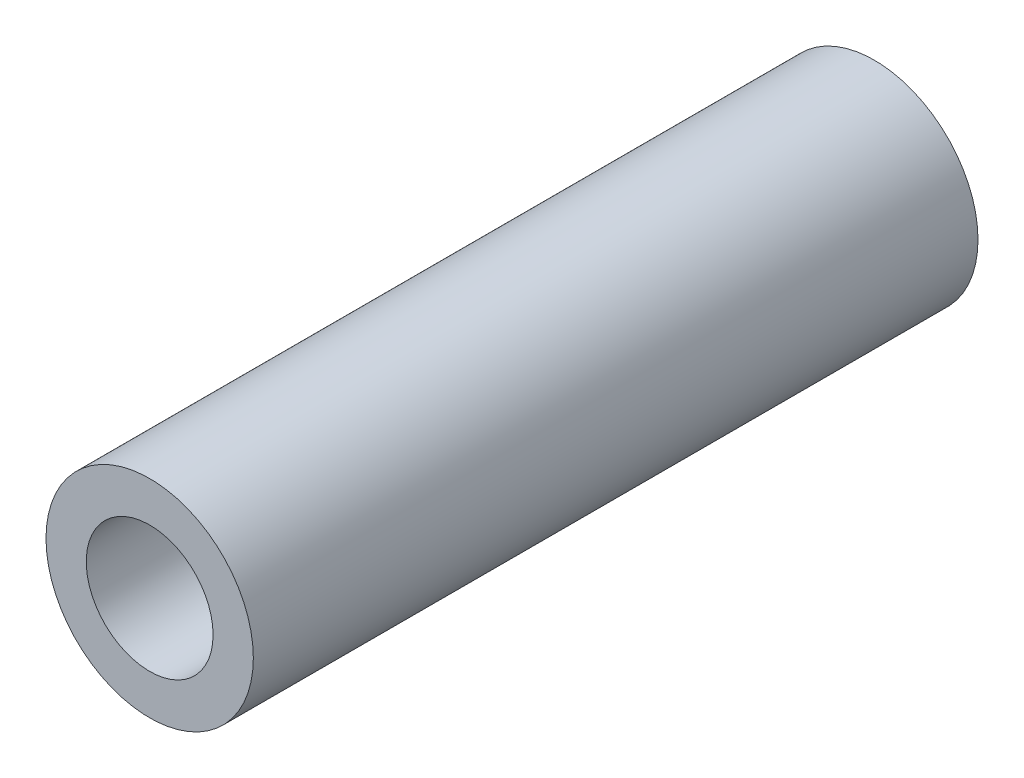
ISO-10303-21;
HEADER;
FILE_DESCRIPTION(('STEP AP214'),'2;1');
FILE_NAME('part.step','',(''),(''),'','','');
FILE_SCHEMA(('AUTOMOTIVE_DESIGN { 1 0 10303 214 1 1 1 1 }'));
ENDSEC;
DATA;
#1=APPLICATION_CONTEXT('core data for automotive mechanical design processes');
#2=APPLICATION_PROTOCOL_DEFINITION('international standard','automotive_design',2000,#1);
#3=PRODUCT_CONTEXT('',#1,'mechanical');
#4=PRODUCT('Part','Part','',(#3));
#5=PRODUCT_RELATED_PRODUCT_CATEGORY('part','',(#4));
#6=PRODUCT_DEFINITION_FORMATION('','',#4);
#7=PRODUCT_DEFINITION_CONTEXT('part definition',#1,'design');
#8=PRODUCT_DEFINITION('design','',#6,#7);
#9=PRODUCT_DEFINITION_SHAPE('','',#8);
#10=(LENGTH_UNIT() NAMED_UNIT(*) SI_UNIT(.MILLI.,.METRE.));
#11=(NAMED_UNIT(*) PLANE_ANGLE_UNIT() SI_UNIT($,.RADIAN.));
#12=(NAMED_UNIT(*) SI_UNIT($,.STERADIAN.) SOLID_ANGLE_UNIT());
#13=UNCERTAINTY_MEASURE_WITH_UNIT(LENGTH_MEASURE(1.E-05),#10,'distance_accuracy_value','');
#14=(GEOMETRIC_REPRESENTATION_CONTEXT(3) GLOBAL_UNCERTAINTY_ASSIGNED_CONTEXT((#13)) GLOBAL_UNIT_ASSIGNED_CONTEXT((#10,
#11,#12)) REPRESENTATION_CONTEXT('',''));
#15=CARTESIAN_POINT('',(0.,0.,0.));
#16=DIRECTION('',(0.,0.,1.));
#17=DIRECTION('',(1.,0.,0.));
#18=AXIS2_PLACEMENT_3D('',#15,#16,#17);
#19=CARTESIAN_POINT('',(33.,0.,18.));
#20=DIRECTION('',(0.,0.,-1.));
#21=DIRECTION('',(-1.,0.,0.));
#22=AXIS2_PLACEMENT_3D('',#19,#20,#21);
#23=CYLINDRICAL_SURFACE('',#22,2.575);
#24=CARTESIAN_POINT('',(33.,0.,18.));
#25=DIRECTION('',(0.,0.,1.));
#26=DIRECTION('',(1.,0.,0.));
#27=AXIS2_PLACEMENT_3D('',#24,#25,#26);
#28=CIRCLE('',#27,2.575);
#29=CARTESIAN_POINT('',(35.575,0.,18.));
#30=VERTEX_POINT('',#29);
#31=EDGE_CURVE('E10',#30,#30,#28,.T.);
#32=ORIENTED_EDGE('',*,*,#31,.F.);
#33=EDGE_LOOP('',(#32));
#34=FACE_BOUND('',#33,.T.);
#35=CARTESIAN_POINT('',(33.,0.,0.));
#36=DIRECTION('',(0.,0.,1.));
#37=DIRECTION('',(1.,0.,0.));
#38=AXIS2_PLACEMENT_3D('',#35,#36,#37);
#39=CIRCLE('',#38,2.575);
#40=CARTESIAN_POINT('',(35.575,0.,0.));
#41=VERTEX_POINT('',#40);
#42=EDGE_CURVE('E40',#41,#41,#39,.T.);
#43=ORIENTED_EDGE('',*,*,#42,.T.);
#44=EDGE_LOOP('',(#43));
#45=FACE_BOUND('',#44,.T.);
#46=ADVANCED_FACE('F37',(#34,#45),#23,.T.);
#47=CARTESIAN_POINT('',(33.,0.,18.));
#48=DIRECTION('',(0.,0.,1.));
#49=DIRECTION('',(1.,0.,0.));
#50=AXIS2_PLACEMENT_3D('',#47,#48,#49);
#51=PLANE('',#50);
#52=CARTESIAN_POINT('',(33.,0.,18.));
#53=DIRECTION('',(0.,0.,1.));
#54=DIRECTION('',(1.,0.,0.));
#55=AXIS2_PLACEMENT_3D('',#52,#53,#54);
#56=CIRCLE('',#55,1.575);
#57=CARTESIAN_POINT('',(34.575,0.,18.));
#58=VERTEX_POINT('',#57);
#59=EDGE_CURVE('E51',#58,#58,#56,.T.);
#60=ORIENTED_EDGE('',*,*,#59,.F.);
#61=EDGE_LOOP('',(#60));
#62=FACE_BOUND('',#61,.T.);
#63=ORIENTED_EDGE('',*,*,#31,.T.);
#64=EDGE_LOOP('',(#63));
#65=FACE_BOUND('',#64,.T.);
#66=ADVANCED_FACE('F58',(#62,#65),#51,.T.);
#67=CARTESIAN_POINT('',(33.,0.,0.));
#68=DIRECTION('',(0.,0.,1.));
#69=DIRECTION('',(1.,0.,0.));
#70=AXIS2_PLACEMENT_3D('',#67,#68,#69);
#71=PLANE('',#70);
#72=CARTESIAN_POINT('',(33.,0.,0.));
#73=DIRECTION('',(0.,0.,1.));
#74=DIRECTION('',(1.,0.,0.));
#75=AXIS2_PLACEMENT_3D('',#72,#73,#74);
#76=CIRCLE('',#75,1.575);
#77=CARTESIAN_POINT('',(34.575,0.,0.));
#78=VERTEX_POINT('',#77);
#79=EDGE_CURVE('E47',#78,#78,#76,.F.);
#80=ORIENTED_EDGE('',*,*,#79,.F.);
#81=EDGE_LOOP('',(#80));
#82=FACE_BOUND('',#81,.T.);
#83=ORIENTED_EDGE('',*,*,#42,.F.);
#84=EDGE_LOOP('',(#83));
#85=FACE_BOUND('',#84,.T.);
#86=ADVANCED_FACE('F60',(#82,#85),#71,.F.);
#87=CARTESIAN_POINT('',(33.,0.,-0.001000000000001));
#88=DIRECTION('',(0.,0.,1.));
#89=DIRECTION('',(1.,0.,0.));
#90=AXIS2_PLACEMENT_3D('',#87,#88,#89);
#91=CYLINDRICAL_SURFACE('',#90,1.575);
#92=ORIENTED_EDGE('',*,*,#59,.T.);
#93=EDGE_LOOP('',(#92));
#94=FACE_BOUND('',#93,.T.);
#95=ORIENTED_EDGE('',*,*,#79,.T.);
#96=EDGE_LOOP('',(#95));
#97=FACE_BOUND('',#96,.T.);
#98=ADVANCED_FACE('F55',(#94,#97),#91,.F.);
#99=CLOSED_SHELL('',(#46,#66,#86,#98));
#100=MANIFOLD_SOLID_BREP('B2',#99);
#101=ADVANCED_BREP_SHAPE_REPRESENTATION('',(#18,#100),#14);
#102=SHAPE_DEFINITION_REPRESENTATION(#9,#101);
ENDSEC;
END-ISO-10303-21;
